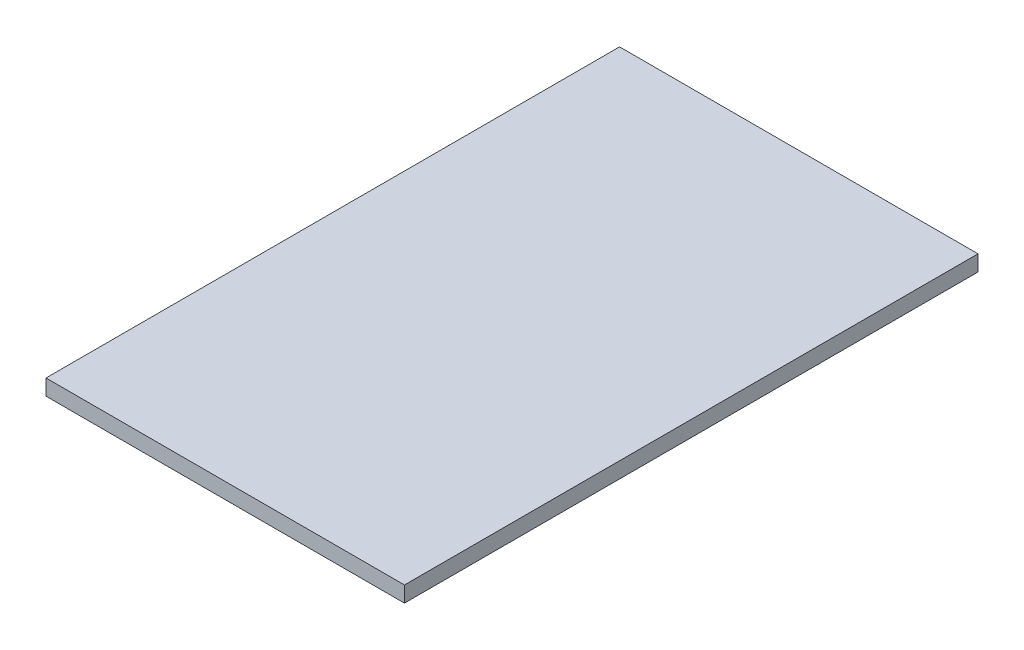
ISO-10303-21;
HEADER;
FILE_DESCRIPTION(('STEP AP214'),'2;1');
FILE_NAME('part.step','',(''),(''),'','','');
FILE_SCHEMA(('AUTOMOTIVE_DESIGN { 1 0 10303 214 1 1 1 1 }'));
ENDSEC;
DATA;
#1=APPLICATION_CONTEXT('core data for automotive mechanical design processes');
#2=APPLICATION_PROTOCOL_DEFINITION('international standard','automotive_design',2000,#1);
#3=PRODUCT_CONTEXT('',#1,'mechanical');
#4=PRODUCT('Part','Part','',(#3));
#5=PRODUCT_RELATED_PRODUCT_CATEGORY('part','',(#4));
#6=PRODUCT_DEFINITION_FORMATION('','',#4);
#7=PRODUCT_DEFINITION_CONTEXT('part definition',#1,'design');
#8=PRODUCT_DEFINITION('design','',#6,#7);
#9=PRODUCT_DEFINITION_SHAPE('','',#8);
#10=(LENGTH_UNIT() NAMED_UNIT(*) SI_UNIT(.MILLI.,.METRE.));
#11=(NAMED_UNIT(*) PLANE_ANGLE_UNIT() SI_UNIT($,.RADIAN.));
#12=(NAMED_UNIT(*) SI_UNIT($,.STERADIAN.) SOLID_ANGLE_UNIT());
#13=UNCERTAINTY_MEASURE_WITH_UNIT(LENGTH_MEASURE(1.E-05),#10,'distance_accuracy_value','');
#14=(GEOMETRIC_REPRESENTATION_CONTEXT(3) GLOBAL_UNCERTAINTY_ASSIGNED_CONTEXT((#13)) GLOBAL_UNIT_ASSIGNED_CONTEXT((#10,
#11,#12)) REPRESENTATION_CONTEXT('',''));
#15=CARTESIAN_POINT('',(0.,0.,0.));
#16=DIRECTION('',(0.,0.,1.));
#17=DIRECTION('',(1.,0.,0.));
#18=AXIS2_PLACEMENT_3D('',#15,#16,#17);
#19=CARTESIAN_POINT('',(25.,1.1,40.));
#20=DIRECTION('',(-1.,0.,0.));
#21=DIRECTION('',(0.,0.,1.));
#22=AXIS2_PLACEMENT_3D('',#19,#20,#21);
#23=PLANE('',#22);
#24=DIRECTION('',(0.,0.,-1.));
#25=VECTOR('',#24,1.);
#26=CARTESIAN_POINT('',(25.,-1.1,40.));
#27=LINE('',#26,#25);
#28=CARTESIAN_POINT('',(25.,-1.1,40.));
#29=VERTEX_POINT('',#28);
#30=CARTESIAN_POINT('',(25.,-1.1,-40.));
#31=VERTEX_POINT('',#30);
#32=EDGE_CURVE('E107',#29,#31,#27,.T.);
#33=ORIENTED_EDGE('',*,*,#32,.T.);
#34=DIRECTION('',(0.,-1.,0.));
#35=VECTOR('',#34,1.);
#36=CARTESIAN_POINT('',(25.,1.1,-40.));
#37=LINE('',#36,#35);
#38=CARTESIAN_POINT('',(25.,1.1,-40.));
#39=VERTEX_POINT('',#38);
#40=EDGE_CURVE('E11',#39,#31,#37,.T.);
#41=ORIENTED_EDGE('',*,*,#40,.F.);
#42=DIRECTION('',(0.,0.,-1.));
#43=VECTOR('',#42,1.);
#44=CARTESIAN_POINT('',(25.,1.1,40.));
#45=LINE('',#44,#43);
#46=CARTESIAN_POINT('',(25.,1.1,40.));
#47=VERTEX_POINT('',#46);
#48=EDGE_CURVE('E91',#47,#39,#45,.T.);
#49=ORIENTED_EDGE('',*,*,#48,.F.);
#50=DIRECTION('',(0.,-1.,0.));
#51=VECTOR('',#50,1.);
#52=CARTESIAN_POINT('',(25.,1.1,40.));
#53=LINE('',#52,#51);
#54=EDGE_CURVE('E103',#47,#29,#53,.T.);
#55=ORIENTED_EDGE('',*,*,#54,.T.);
#56=EDGE_LOOP('',(#33,#41,#49,#55));
#57=FACE_BOUND('',#56,.T.);
#58=ADVANCED_FACE('F39',(#57),#23,.F.);
#59=CARTESIAN_POINT('',(-25.,1.1,-40.));
#60=DIRECTION('',(0.,0.,1.));
#61=DIRECTION('',(1.,0.,0.));
#62=AXIS2_PLACEMENT_3D('',#59,#60,#61);
#63=PLANE('',#62);
#64=DIRECTION('',(-1.,0.,0.));
#65=VECTOR('',#64,1.);
#66=CARTESIAN_POINT('',(-25.,-1.1,-40.));
#67=LINE('',#66,#65);
#68=CARTESIAN_POINT('',(-25.,-1.1,-40.));
#69=VERTEX_POINT('',#68);
#70=EDGE_CURVE('E96',#31,#69,#67,.T.);
#71=ORIENTED_EDGE('',*,*,#70,.T.);
#72=DIRECTION('',(0.,-1.,0.));
#73=VECTOR('',#72,1.);
#74=CARTESIAN_POINT('',(-25.,1.1,-40.));
#75=LINE('',#74,#73);
#76=CARTESIAN_POINT('',(-25.,1.1,-40.));
#77=VERTEX_POINT('',#76);
#78=EDGE_CURVE('E48',#77,#69,#75,.T.);
#79=ORIENTED_EDGE('',*,*,#78,.F.);
#80=DIRECTION('',(-1.,0.,0.));
#81=VECTOR('',#80,1.);
#82=CARTESIAN_POINT('',(-25.,1.1,-40.));
#83=LINE('',#82,#81);
#84=EDGE_CURVE('E86',#39,#77,#83,.T.);
#85=ORIENTED_EDGE('',*,*,#84,.F.);
#86=ORIENTED_EDGE('',*,*,#40,.T.);
#87=EDGE_LOOP('',(#71,#79,#85,#86));
#88=FACE_BOUND('',#87,.T.);
#89=ADVANCED_FACE('F95',(#88),#63,.F.);
#90=CARTESIAN_POINT('',(-25.,1.1,40.));
#91=DIRECTION('',(1.,0.,0.));
#92=DIRECTION('',(0.,0.,-1.));
#93=AXIS2_PLACEMENT_3D('',#90,#91,#92);
#94=PLANE('',#93);
#95=DIRECTION('',(0.,0.,1.));
#96=VECTOR('',#95,1.);
#97=CARTESIAN_POINT('',(-25.,-1.1,40.));
#98=LINE('',#97,#96);
#99=CARTESIAN_POINT('',(-25.,-1.1,40.));
#100=VERTEX_POINT('',#99);
#101=EDGE_CURVE('E73',#69,#100,#98,.T.);
#102=ORIENTED_EDGE('',*,*,#101,.T.);
#103=DIRECTION('',(0.,-1.,0.));
#104=VECTOR('',#103,1.);
#105=CARTESIAN_POINT('',(-25.,1.1,40.));
#106=LINE('',#105,#104);
#107=CARTESIAN_POINT('',(-25.,1.1,40.));
#108=VERTEX_POINT('',#107);
#109=EDGE_CURVE('E98',#108,#100,#106,.T.);
#110=ORIENTED_EDGE('',*,*,#109,.F.);
#111=DIRECTION('',(0.,0.,1.));
#112=VECTOR('',#111,1.);
#113=CARTESIAN_POINT('',(-25.,1.1,40.));
#114=LINE('',#113,#112);
#115=EDGE_CURVE('E89',#77,#108,#114,.T.);
#116=ORIENTED_EDGE('',*,*,#115,.F.);
#117=ORIENTED_EDGE('',*,*,#78,.T.);
#118=EDGE_LOOP('',(#102,#110,#116,#117));
#119=FACE_BOUND('',#118,.T.);
#120=ADVANCED_FACE('F99',(#119),#94,.F.);
#121=CARTESIAN_POINT('',(-25.,1.1,40.));
#122=DIRECTION('',(0.,0.,-1.));
#123=DIRECTION('',(-1.,0.,0.));
#124=AXIS2_PLACEMENT_3D('',#121,#122,#123);
#125=PLANE('',#124);
#126=DIRECTION('',(1.,0.,0.));
#127=VECTOR('',#126,1.);
#128=CARTESIAN_POINT('',(-25.,-1.1,40.));
#129=LINE('',#128,#127);
#130=EDGE_CURVE('E79',#100,#29,#129,.T.);
#131=ORIENTED_EDGE('',*,*,#130,.T.);
#132=ORIENTED_EDGE('',*,*,#54,.F.);
#133=DIRECTION('',(1.,0.,0.));
#134=VECTOR('',#133,1.);
#135=CARTESIAN_POINT('',(-25.,1.1,40.));
#136=LINE('',#135,#134);
#137=EDGE_CURVE('E56',#108,#47,#136,.T.);
#138=ORIENTED_EDGE('',*,*,#137,.F.);
#139=ORIENTED_EDGE('',*,*,#109,.T.);
#140=EDGE_LOOP('',(#131,#132,#138,#139));
#141=FACE_BOUND('',#140,.T.);
#142=ADVANCED_FACE('F120',(#141),#125,.F.);
#143=CARTESIAN_POINT('',(0.,1.1,0.));
#144=DIRECTION('',(0.,-1.,0.));
#145=DIRECTION('',(0.,0.,-1.));
#146=AXIS2_PLACEMENT_3D('',#143,#144,#145);
#147=PLANE('',#146);
#148=ORIENTED_EDGE('',*,*,#48,.T.);
#149=ORIENTED_EDGE('',*,*,#84,.T.);
#150=ORIENTED_EDGE('',*,*,#115,.T.);
#151=ORIENTED_EDGE('',*,*,#137,.T.);
#152=EDGE_LOOP('',(#148,#149,#150,#151));
#153=FACE_BOUND('',#152,.T.);
#154=ADVANCED_FACE('F87',(#153),#147,.F.);
#155=CARTESIAN_POINT('',(0.,-1.1,0.));
#156=DIRECTION('',(0.,-1.,0.));
#157=DIRECTION('',(0.,0.,-1.));
#158=AXIS2_PLACEMENT_3D('',#155,#156,#157);
#159=PLANE('',#158);
#160=ORIENTED_EDGE('',*,*,#32,.F.);
#161=ORIENTED_EDGE('',*,*,#130,.F.);
#162=ORIENTED_EDGE('',*,*,#101,.F.);
#163=ORIENTED_EDGE('',*,*,#70,.F.);
#164=EDGE_LOOP('',(#160,#161,#162,#163));
#165=FACE_BOUND('',#164,.T.);
#166=ADVANCED_FACE('F123',(#165),#159,.T.);
#167=CLOSED_SHELL('',(#58,#89,#120,#142,#154,#166));
#168=MANIFOLD_SOLID_BREP('B2',#167);
#169=ADVANCED_BREP_SHAPE_REPRESENTATION('',(#18,#168),#14);
#170=SHAPE_DEFINITION_REPRESENTATION(#9,#169);
ENDSEC;
END-ISO-10303-21;
